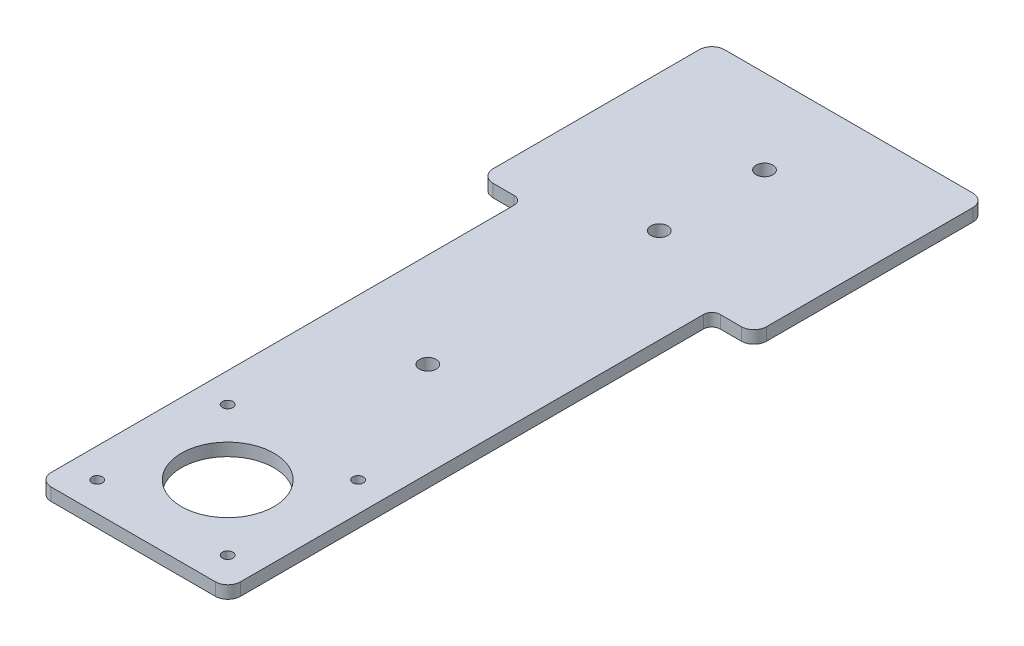
ISO-10303-21;
HEADER;
FILE_DESCRIPTION(('STEP AP214'),'2;1');
FILE_NAME('part.step','',(''),(''),'','','');
FILE_SCHEMA(('AUTOMOTIVE_DESIGN { 1 0 10303 214 1 1 1 1 }'));
ENDSEC;
DATA;
#1=APPLICATION_CONTEXT('core data for automotive mechanical design processes');
#2=APPLICATION_PROTOCOL_DEFINITION('international standard','automotive_design',2000,#1);
#3=PRODUCT_CONTEXT('',#1,'mechanical');
#4=PRODUCT('Part','Part','',(#3));
#5=PRODUCT_RELATED_PRODUCT_CATEGORY('part','',(#4));
#6=PRODUCT_DEFINITION_FORMATION('','',#4);
#7=PRODUCT_DEFINITION_CONTEXT('part definition',#1,'design');
#8=PRODUCT_DEFINITION('design','',#6,#7);
#9=PRODUCT_DEFINITION_SHAPE('','',#8);
#10=(LENGTH_UNIT() NAMED_UNIT(*) SI_UNIT(.MILLI.,.METRE.));
#11=(NAMED_UNIT(*) PLANE_ANGLE_UNIT() SI_UNIT($,.RADIAN.));
#12=(NAMED_UNIT(*) SI_UNIT($,.STERADIAN.) SOLID_ANGLE_UNIT());
#13=UNCERTAINTY_MEASURE_WITH_UNIT(LENGTH_MEASURE(1.E-05),#10,'distance_accuracy_value','');
#14=(GEOMETRIC_REPRESENTATION_CONTEXT(3) GLOBAL_UNCERTAINTY_ASSIGNED_CONTEXT((#13)) GLOBAL_UNIT_ASSIGNED_CONTEXT((#10,
#11,#12)) REPRESENTATION_CONTEXT('',''));
#15=CARTESIAN_POINT('',(0.,0.,0.));
#16=DIRECTION('',(0.,0.,1.));
#17=DIRECTION('',(1.,0.,0.));
#18=AXIS2_PLACEMENT_3D('',#15,#16,#17);
#19=CARTESIAN_POINT('',(-32.5,3.,0.));
#20=DIRECTION('',(1.,0.,0.));
#21=DIRECTION('',(0.,0.,-1.));
#22=AXIS2_PLACEMENT_3D('',#19,#20,#21);
#23=PLANE('',#22);
#24=DIRECTION('',(0.,0.,1.));
#25=VECTOR('',#24,1.);
#26=CARTESIAN_POINT('',(-32.5,0.,0.));
#27=LINE('',#26,#25);
#28=CARTESIAN_POINT('',(-32.5,0.,-108.613624170187));
#29=VERTEX_POINT('',#28);
#30=CARTESIAN_POINT('',(-32.5,0.,-59.6136241701869));
#31=VERTEX_POINT('',#30);
#32=EDGE_CURVE('E269',#29,#31,#27,.T.);
#33=ORIENTED_EDGE('',*,*,#32,.T.);
#34=DIRECTION('',(0.,-1.,0.));
#35=VECTOR('',#34,1.);
#36=CARTESIAN_POINT('',(-32.5,3.,-59.6136241701869));
#37=LINE('',#36,#35);
#38=CARTESIAN_POINT('',(-32.5,3.,-59.6136241701869));
#39=VERTEX_POINT('',#38);
#40=EDGE_CURVE('E202',#31,#39,#37,.F.);
#41=ORIENTED_EDGE('',*,*,#40,.T.);
#42=DIRECTION('',(0.,0.,1.));
#43=VECTOR('',#42,1.);
#44=CARTESIAN_POINT('',(-32.5,3.,0.));
#45=LINE('',#44,#43);
#46=CARTESIAN_POINT('',(-32.5,3.,-108.613624170187));
#47=VERTEX_POINT('',#46);
#48=EDGE_CURVE('E309',#47,#39,#45,.T.);
#49=ORIENTED_EDGE('',*,*,#48,.F.);
#50=DIRECTION('',(0.,-1.,0.));
#51=VECTOR('',#50,1.);
#52=CARTESIAN_POINT('',(-32.5,0.,-108.613624170187));
#53=LINE('',#52,#51);
#54=EDGE_CURVE('E189',#47,#29,#53,.T.);
#55=ORIENTED_EDGE('',*,*,#54,.T.);
#56=EDGE_LOOP('',(#33,#41,#49,#55));
#57=FACE_BOUND('',#56,.T.);
#58=ADVANCED_FACE('F41',(#57),#23,.F.);
#59=CARTESIAN_POINT('',(0.,3.,-56.613624170187));
#60=DIRECTION('',(0.,0.,-1.));
#61=DIRECTION('',(-1.,0.,0.));
#62=AXIS2_PLACEMENT_3D('',#59,#60,#61);
#63=PLANE('',#62);
#64=DIRECTION('',(1.,0.,0.));
#65=VECTOR('',#64,1.);
#66=CARTESIAN_POINT('',(0.,0.,-56.613624170187));
#67=LINE('',#66,#65);
#68=CARTESIAN_POINT('',(-29.5,0.,-56.6136241701869));
#69=VERTEX_POINT('',#68);
#70=CARTESIAN_POINT('',(-24.5,0.,-56.613624170187));
#71=VERTEX_POINT('',#70);
#72=EDGE_CURVE('E266',#69,#71,#67,.T.);
#73=ORIENTED_EDGE('',*,*,#72,.T.);
#74=DIRECTION('',(0.,-1.,0.));
#75=VECTOR('',#74,1.);
#76=CARTESIAN_POINT('',(-24.5,3.,-56.613624170187));
#77=LINE('',#76,#75);
#78=CARTESIAN_POINT('',(-24.5,3.,-56.613624170187));
#79=VERTEX_POINT('',#78);
#80=EDGE_CURVE('E238',#71,#79,#77,.F.);
#81=ORIENTED_EDGE('',*,*,#80,.T.);
#82=DIRECTION('',(1.,0.,0.));
#83=VECTOR('',#82,1.);
#84=CARTESIAN_POINT('',(0.,3.,-56.613624170187));
#85=LINE('',#84,#83);
#86=CARTESIAN_POINT('',(-29.5,3.,-56.6136241701869));
#87=VERTEX_POINT('',#86);
#88=EDGE_CURVE('E306',#87,#79,#85,.T.);
#89=ORIENTED_EDGE('',*,*,#88,.F.);
#90=DIRECTION('',(0.,-1.,0.));
#91=VECTOR('',#90,1.);
#92=CARTESIAN_POINT('',(-29.5,3.,-56.6136241701869));
#93=LINE('',#92,#91);
#94=EDGE_CURVE('E197',#87,#69,#93,.T.);
#95=ORIENTED_EDGE('',*,*,#94,.T.);
#96=EDGE_LOOP('',(#73,#81,#89,#95));
#97=FACE_BOUND('',#96,.T.);
#98=ADVANCED_FACE('F353',(#97),#63,.F.);
#99=CARTESIAN_POINT('',(-22.5,3.,0.));
#100=DIRECTION('',(-1.,0.,0.));
#101=DIRECTION('',(0.,0.,1.));
#102=AXIS2_PLACEMENT_3D('',#99,#100,#101);
#103=PLANE('',#102);
#104=DIRECTION('',(0.,0.,-1.));
#105=VECTOR('',#104,1.);
#106=CARTESIAN_POINT('',(-22.5,3.,0.));
#107=LINE('',#106,#105);
#108=CARTESIAN_POINT('',(-22.5,3.,55.3863758298131));
#109=VERTEX_POINT('',#108);
#110=CARTESIAN_POINT('',(-22.5,3.,-54.6136241701869));
#111=VERTEX_POINT('',#110);
#112=EDGE_CURVE('E303',#109,#111,#107,.T.);
#113=ORIENTED_EDGE('',*,*,#112,.T.);
#114=DIRECTION('',(0.,-1.,0.));
#115=VECTOR('',#114,1.);
#116=CARTESIAN_POINT('',(-22.5,3.,-54.6136241701869));
#117=LINE('',#116,#115);
#118=CARTESIAN_POINT('',(-22.5,0.,-54.6136241701869));
#119=VERTEX_POINT('',#118);
#120=EDGE_CURVE('E235',#111,#119,#117,.T.);
#121=ORIENTED_EDGE('',*,*,#120,.T.);
#122=DIRECTION('',(0.,0.,-1.));
#123=VECTOR('',#122,1.);
#124=CARTESIAN_POINT('',(-22.5,0.,0.));
#125=LINE('',#124,#123);
#126=CARTESIAN_POINT('',(-22.5,0.,55.3863758298131));
#127=VERTEX_POINT('',#126);
#128=EDGE_CURVE('E263',#127,#119,#125,.T.);
#129=ORIENTED_EDGE('',*,*,#128,.F.);
#130=DIRECTION('',(0.,-1.,0.));
#131=VECTOR('',#130,1.);
#132=CARTESIAN_POINT('',(-22.5,3.,55.3863758298131));
#133=LINE('',#132,#131);
#134=EDGE_CURVE('E231',#127,#109,#133,.F.);
#135=ORIENTED_EDGE('',*,*,#134,.T.);
#136=EDGE_LOOP('',(#113,#121,#129,#135));
#137=FACE_BOUND('',#136,.T.);
#138=ADVANCED_FACE('F359',(#137),#103,.T.);
#139=CARTESIAN_POINT('',(0.,3.,58.3863758298131));
#140=DIRECTION('',(0.,0.,1.));
#141=DIRECTION('',(1.,0.,0.));
#142=AXIS2_PLACEMENT_3D('',#139,#140,#141);
#143=PLANE('',#142);
#144=DIRECTION('',(-1.,0.,0.));
#145=VECTOR('',#144,1.);
#146=CARTESIAN_POINT('',(0.,3.,58.3863758298131));
#147=LINE('',#146,#145);
#148=CARTESIAN_POINT('',(19.5,3.,58.3863758298131));
#149=VERTEX_POINT('',#148);
#150=CARTESIAN_POINT('',(-19.5,3.,58.3863758298131));
#151=VERTEX_POINT('',#150);
#152=EDGE_CURVE('E300',#149,#151,#147,.T.);
#153=ORIENTED_EDGE('',*,*,#152,.T.);
#154=DIRECTION('',(0.,-1.,0.));
#155=VECTOR('',#154,1.);
#156=CARTESIAN_POINT('',(-19.5,3.,58.3863758298131));
#157=LINE('',#156,#155);
#158=CARTESIAN_POINT('',(-19.5,0.,58.3863758298131));
#159=VERTEX_POINT('',#158);
#160=EDGE_CURVE('E226',#151,#159,#157,.T.);
#161=ORIENTED_EDGE('',*,*,#160,.T.);
#162=DIRECTION('',(-1.,0.,0.));
#163=VECTOR('',#162,1.);
#164=CARTESIAN_POINT('',(0.,0.,58.3863758298131));
#165=LINE('',#164,#163);
#166=CARTESIAN_POINT('',(19.5,0.,58.3863758298131));
#167=VERTEX_POINT('',#166);
#168=EDGE_CURVE('E259',#167,#159,#165,.T.);
#169=ORIENTED_EDGE('',*,*,#168,.F.);
#170=DIRECTION('',(0.,-1.,0.));
#171=VECTOR('',#170,1.);
#172=CARTESIAN_POINT('',(19.5,3.,58.3863758298131));
#173=LINE('',#172,#171);
#174=EDGE_CURVE('E222',#167,#149,#173,.F.);
#175=ORIENTED_EDGE('',*,*,#174,.T.);
#176=EDGE_LOOP('',(#153,#161,#169,#175));
#177=FACE_BOUND('',#176,.T.);
#178=ADVANCED_FACE('F430',(#177),#143,.T.);
#179=CARTESIAN_POINT('',(22.5,3.,0.));
#180=DIRECTION('',(-1.,0.,0.));
#181=DIRECTION('',(0.,0.,1.));
#182=AXIS2_PLACEMENT_3D('',#179,#180,#181);
#183=PLANE('',#182);
#184=DIRECTION('',(0.,0.,-1.));
#185=VECTOR('',#184,1.);
#186=CARTESIAN_POINT('',(22.5,0.,0.));
#187=LINE('',#186,#185);
#188=CARTESIAN_POINT('',(22.5,0.,55.3863758298131));
#189=VERTEX_POINT('',#188);
#190=CARTESIAN_POINT('',(22.5,0.,-54.6136241701869));
#191=VERTEX_POINT('',#190);
#192=EDGE_CURVE('E256',#189,#191,#187,.T.);
#193=ORIENTED_EDGE('',*,*,#192,.T.);
#194=DIRECTION('',(0.,-1.,0.));
#195=VECTOR('',#194,1.);
#196=CARTESIAN_POINT('',(22.5,3.,-54.6136241701869));
#197=LINE('',#196,#195);
#198=CARTESIAN_POINT('',(22.5,3.,-54.6136241701869));
#199=VERTEX_POINT('',#198);
#200=EDGE_CURVE('E62',#191,#199,#197,.F.);
#201=ORIENTED_EDGE('',*,*,#200,.T.);
#202=DIRECTION('',(0.,0.,-1.));
#203=VECTOR('',#202,1.);
#204=CARTESIAN_POINT('',(22.5,3.,0.));
#205=LINE('',#204,#203);
#206=CARTESIAN_POINT('',(22.5,3.,55.3863758298131));
#207=VERTEX_POINT('',#206);
#208=EDGE_CURVE('E298',#207,#199,#205,.T.);
#209=ORIENTED_EDGE('',*,*,#208,.F.);
#210=DIRECTION('',(0.,-1.,0.));
#211=VECTOR('',#210,1.);
#212=CARTESIAN_POINT('',(22.5,0.,55.3863758298131));
#213=LINE('',#212,#211);
#214=EDGE_CURVE('E217',#207,#189,#213,.T.);
#215=ORIENTED_EDGE('',*,*,#214,.T.);
#216=EDGE_LOOP('',(#193,#201,#209,#215));
#217=FACE_BOUND('',#216,.T.);
#218=ADVANCED_FACE('F434',(#217),#183,.F.);
#219=CARTESIAN_POINT('',(0.,3.,-56.613624170187));
#220=DIRECTION('',(0.,0.,-1.));
#221=DIRECTION('',(-1.,0.,0.));
#222=AXIS2_PLACEMENT_3D('',#219,#220,#221);
#223=PLANE('',#222);
#224=DIRECTION('',(1.,0.,0.));
#225=VECTOR('',#224,1.);
#226=CARTESIAN_POINT('',(0.,3.,-56.613624170187));
#227=LINE('',#226,#225);
#228=CARTESIAN_POINT('',(24.5,3.,-56.613624170187));
#229=VERTEX_POINT('',#228);
#230=CARTESIAN_POINT('',(29.5,3.,-56.6136241701869));
#231=VERTEX_POINT('',#230);
#232=EDGE_CURVE('E252',#229,#231,#227,.T.);
#233=ORIENTED_EDGE('',*,*,#232,.F.);
#234=DIRECTION('',(0.,-1.,0.));
#235=VECTOR('',#234,1.);
#236=CARTESIAN_POINT('',(24.5,0.,-56.613624170187));
#237=LINE('',#236,#235);
#238=CARTESIAN_POINT('',(24.5,0.,-56.613624170187));
#239=VERTEX_POINT('',#238);
#240=EDGE_CURVE('E244',#229,#239,#237,.T.);
#241=ORIENTED_EDGE('',*,*,#240,.T.);
#242=DIRECTION('',(1.,0.,0.));
#243=VECTOR('',#242,1.);
#244=CARTESIAN_POINT('',(0.,0.,-56.613624170187));
#245=LINE('',#244,#243);
#246=CARTESIAN_POINT('',(29.5,0.,-56.6136241701869));
#247=VERTEX_POINT('',#246);
#248=EDGE_CURVE('E251',#239,#247,#245,.T.);
#249=ORIENTED_EDGE('',*,*,#248,.T.);
#250=DIRECTION('',(0.,-1.,0.));
#251=VECTOR('',#250,1.);
#252=CARTESIAN_POINT('',(29.5,3.,-56.6136241701869));
#253=LINE('',#252,#251);
#254=EDGE_CURVE('E212',#247,#231,#253,.F.);
#255=ORIENTED_EDGE('',*,*,#254,.T.);
#256=EDGE_LOOP('',(#233,#241,#249,#255));
#257=FACE_BOUND('',#256,.T.);
#258=ADVANCED_FACE('F250',(#257),#223,.F.);
#259=CARTESIAN_POINT('',(32.5,3.,0.));
#260=DIRECTION('',(1.,0.,0.));
#261=DIRECTION('',(0.,0.,-1.));
#262=AXIS2_PLACEMENT_3D('',#259,#260,#261);
#263=PLANE('',#262);
#264=DIRECTION('',(0.,0.,1.));
#265=VECTOR('',#264,1.);
#266=CARTESIAN_POINT('',(32.5,3.,0.));
#267=LINE('',#266,#265);
#268=CARTESIAN_POINT('',(32.5,3.,-108.613624170187));
#269=VERTEX_POINT('',#268);
#270=CARTESIAN_POINT('',(32.5,3.,-59.6136241701869));
#271=VERTEX_POINT('',#270);
#272=EDGE_CURVE('E294',#269,#271,#267,.T.);
#273=ORIENTED_EDGE('',*,*,#272,.T.);
#274=DIRECTION('',(0.,-1.,0.));
#275=VECTOR('',#274,1.);
#276=CARTESIAN_POINT('',(32.5,0.,-59.6136241701869));
#277=LINE('',#276,#275);
#278=CARTESIAN_POINT('',(32.5,0.,-59.6136241701869));
#279=VERTEX_POINT('',#278);
#280=EDGE_CURVE('E206',#271,#279,#277,.T.);
#281=ORIENTED_EDGE('',*,*,#280,.T.);
#282=DIRECTION('',(0.,0.,1.));
#283=VECTOR('',#282,1.);
#284=CARTESIAN_POINT('',(32.5,0.,0.));
#285=LINE('',#284,#283);
#286=CARTESIAN_POINT('',(32.5,0.,-108.613624170187));
#287=VERTEX_POINT('',#286);
#288=EDGE_CURVE('E166',#287,#279,#285,.T.);
#289=ORIENTED_EDGE('',*,*,#288,.F.);
#290=DIRECTION('',(0.,-1.,0.));
#291=VECTOR('',#290,1.);
#292=CARTESIAN_POINT('',(32.5,3.,-108.613624170187));
#293=LINE('',#292,#291);
#294=EDGE_CURVE('E174',#287,#269,#293,.F.);
#295=ORIENTED_EDGE('',*,*,#294,.T.);
#296=EDGE_LOOP('',(#273,#281,#289,#295));
#297=FACE_BOUND('',#296,.T.);
#298=ADVANCED_FACE('F446',(#297),#263,.T.);
#299=CARTESIAN_POINT('',(0.,3.,-111.613624170187));
#300=DIRECTION('',(0.,0.,-1.));
#301=DIRECTION('',(-1.,0.,0.));
#302=AXIS2_PLACEMENT_3D('',#299,#300,#301);
#303=PLANE('',#302);
#304=DIRECTION('',(1.,0.,0.));
#305=VECTOR('',#304,1.);
#306=CARTESIAN_POINT('',(0.,0.,-111.613624170187));
#307=LINE('',#306,#305);
#308=CARTESIAN_POINT('',(-29.5,0.,-111.613624170187));
#309=VERTEX_POINT('',#308);
#310=CARTESIAN_POINT('',(29.5,0.,-111.613624170187));
#311=VERTEX_POINT('',#310);
#312=EDGE_CURVE('E152',#309,#311,#307,.T.);
#313=ORIENTED_EDGE('',*,*,#312,.F.);
#314=DIRECTION('',(0.,-1.,0.));
#315=VECTOR('',#314,1.);
#316=CARTESIAN_POINT('',(-29.5,3.,-111.613624170187));
#317=LINE('',#316,#315);
#318=CARTESIAN_POINT('',(-29.5,3.,-111.613624170187));
#319=VERTEX_POINT('',#318);
#320=EDGE_CURVE('E193',#309,#319,#317,.F.);
#321=ORIENTED_EDGE('',*,*,#320,.T.);
#322=DIRECTION('',(1.,0.,0.));
#323=VECTOR('',#322,1.);
#324=CARTESIAN_POINT('',(0.,3.,-111.613624170187));
#325=LINE('',#324,#323);
#326=CARTESIAN_POINT('',(29.5,3.,-111.613624170187));
#327=VERTEX_POINT('',#326);
#328=EDGE_CURVE('E178',#319,#327,#325,.T.);
#329=ORIENTED_EDGE('',*,*,#328,.T.);
#330=DIRECTION('',(0.,-1.,0.));
#331=VECTOR('',#330,1.);
#332=CARTESIAN_POINT('',(29.5,3.,-111.613624170187));
#333=LINE('',#332,#331);
#334=EDGE_CURVE('E173',#327,#311,#333,.T.);
#335=ORIENTED_EDGE('',*,*,#334,.T.);
#336=EDGE_LOOP('',(#313,#321,#329,#335));
#337=FACE_BOUND('',#336,.T.);
#338=ADVANCED_FACE('F176',(#337),#303,.T.);
#339=CARTESIAN_POINT('',(0.,3.,-91.6136241701869));
#340=DIRECTION('',(0.,-1.,0.));
#341=DIRECTION('',(0.,0.,-1.));
#342=AXIS2_PLACEMENT_3D('',#339,#340,#341);
#343=CYLINDRICAL_SURFACE('',#342,2.);
#344=CARTESIAN_POINT('',(0.,3.,-91.6136241701869));
#345=DIRECTION('',(0.,1.,0.));
#346=DIRECTION('',(0.,0.,1.));
#347=AXIS2_PLACEMENT_3D('',#344,#345,#346);
#348=CIRCLE('',#347,2.);
#349=CARTESIAN_POINT('',(0.,3.,-89.6136241701869));
#350=VERTEX_POINT('',#349);
#351=EDGE_CURVE('E312',#350,#350,#348,.T.);
#352=ORIENTED_EDGE('',*,*,#351,.T.);
#353=EDGE_LOOP('',(#352));
#354=FACE_BOUND('',#353,.T.);
#355=CARTESIAN_POINT('',(0.,0.,-91.6136241701869));
#356=DIRECTION('',(0.,1.,0.));
#357=DIRECTION('',(0.,0.,1.));
#358=AXIS2_PLACEMENT_3D('',#355,#356,#357);
#359=CIRCLE('',#358,2.);
#360=CARTESIAN_POINT('',(0.,0.,-89.6136241701869));
#361=VERTEX_POINT('',#360);
#362=EDGE_CURVE('E272',#361,#361,#359,.T.);
#363=ORIENTED_EDGE('',*,*,#362,.F.);
#364=EDGE_LOOP('',(#363));
#365=FACE_BOUND('',#364,.T.);
#366=ADVANCED_FACE('F364',(#354,#365),#343,.F.);
#367=CARTESIAN_POINT('',(0.,3.,-66.6136241701869));
#368=DIRECTION('',(0.,-1.,0.));
#369=DIRECTION('',(0.,0.,-1.));
#370=AXIS2_PLACEMENT_3D('',#367,#368,#369);
#371=CYLINDRICAL_SURFACE('',#370,2.);
#372=CARTESIAN_POINT('',(0.,3.,-66.6136241701869));
#373=DIRECTION('',(0.,1.,0.));
#374=DIRECTION('',(0.,0.,1.));
#375=AXIS2_PLACEMENT_3D('',#372,#373,#374);
#376=CIRCLE('',#375,2.);
#377=CARTESIAN_POINT('',(0.,3.,-64.6136241701869));
#378=VERTEX_POINT('',#377);
#379=EDGE_CURVE('E315',#378,#378,#376,.T.);
#380=ORIENTED_EDGE('',*,*,#379,.T.);
#381=EDGE_LOOP('',(#380));
#382=FACE_BOUND('',#381,.T.);
#383=CARTESIAN_POINT('',(0.,0.,-66.6136241701869));
#384=DIRECTION('',(0.,1.,0.));
#385=DIRECTION('',(0.,0.,1.));
#386=AXIS2_PLACEMENT_3D('',#383,#384,#385);
#387=CIRCLE('',#386,2.);
#388=CARTESIAN_POINT('',(0.,0.,-64.6136241701869));
#389=VERTEX_POINT('',#388);
#390=EDGE_CURVE('E275',#389,#389,#387,.T.);
#391=ORIENTED_EDGE('',*,*,#390,.F.);
#392=EDGE_LOOP('',(#391));
#393=FACE_BOUND('',#392,.T.);
#394=ADVANCED_FACE('F367',(#382,#393),#371,.F.);
#395=CARTESIAN_POINT('',(-15.5,3.,20.4540396754964));
#396=DIRECTION('',(0.,-1.,0.));
#397=DIRECTION('',(0.,0.,-1.));
#398=AXIS2_PLACEMENT_3D('',#395,#396,#397);
#399=CYLINDRICAL_SURFACE('',#398,1.25);
#400=CARTESIAN_POINT('',(-15.5,3.,20.4540396754964));
#401=DIRECTION('',(0.,1.,0.));
#402=DIRECTION('',(0.,0.,1.));
#403=AXIS2_PLACEMENT_3D('',#400,#401,#402);
#404=CIRCLE('',#403,1.25);
#405=CARTESIAN_POINT('',(-15.5,3.,21.7040396754964));
#406=VERTEX_POINT('',#405);
#407=EDGE_CURVE('E318',#406,#406,#404,.T.);
#408=ORIENTED_EDGE('',*,*,#407,.T.);
#409=EDGE_LOOP('',(#408));
#410=FACE_BOUND('',#409,.T.);
#411=CARTESIAN_POINT('',(-15.5,0.,20.4540396754964));
#412=DIRECTION('',(0.,1.,0.));
#413=DIRECTION('',(0.,0.,1.));
#414=AXIS2_PLACEMENT_3D('',#411,#412,#413);
#415=CIRCLE('',#414,1.25);
#416=CARTESIAN_POINT('',(-15.5,0.,21.7040396754964));
#417=VERTEX_POINT('',#416);
#418=EDGE_CURVE('E278',#417,#417,#415,.T.);
#419=ORIENTED_EDGE('',*,*,#418,.F.);
#420=EDGE_LOOP('',(#419));
#421=FACE_BOUND('',#420,.T.);
#422=ADVANCED_FACE('F371',(#410,#421),#399,.F.);
#423=CARTESIAN_POINT('',(-15.5,3.,51.4540396754964));
#424=DIRECTION('',(0.,-1.,0.));
#425=DIRECTION('',(0.,0.,-1.));
#426=AXIS2_PLACEMENT_3D('',#423,#424,#425);
#427=CYLINDRICAL_SURFACE('',#426,1.25);
#428=CARTESIAN_POINT('',(-15.5,3.,51.4540396754964));
#429=DIRECTION('',(0.,1.,0.));
#430=DIRECTION('',(0.,0.,1.));
#431=AXIS2_PLACEMENT_3D('',#428,#429,#430);
#432=CIRCLE('',#431,1.25);
#433=CARTESIAN_POINT('',(-15.5,3.,52.7040396754964));
#434=VERTEX_POINT('',#433);
#435=EDGE_CURVE('E321',#434,#434,#432,.T.);
#436=ORIENTED_EDGE('',*,*,#435,.T.);
#437=EDGE_LOOP('',(#436));
#438=FACE_BOUND('',#437,.T.);
#439=CARTESIAN_POINT('',(-15.5,0.,51.4540396754964));
#440=DIRECTION('',(0.,1.,0.));
#441=DIRECTION('',(0.,0.,1.));
#442=AXIS2_PLACEMENT_3D('',#439,#440,#441);
#443=CIRCLE('',#442,1.25);
#444=CARTESIAN_POINT('',(-15.5,0.,52.7040396754964));
#445=VERTEX_POINT('',#444);
#446=EDGE_CURVE('E281',#445,#445,#443,.T.);
#447=ORIENTED_EDGE('',*,*,#446,.F.);
#448=EDGE_LOOP('',(#447));
#449=FACE_BOUND('',#448,.T.);
#450=ADVANCED_FACE('F375',(#438,#449),#427,.F.);
#451=CARTESIAN_POINT('',(15.5,3.,51.4540396754964));
#452=DIRECTION('',(0.,-1.,0.));
#453=DIRECTION('',(0.,0.,-1.));
#454=AXIS2_PLACEMENT_3D('',#451,#452,#453);
#455=CYLINDRICAL_SURFACE('',#454,1.25);
#456=CARTESIAN_POINT('',(15.5,3.,51.4540396754964));
#457=DIRECTION('',(0.,1.,0.));
#458=DIRECTION('',(0.,0.,1.));
#459=AXIS2_PLACEMENT_3D('',#456,#457,#458);
#460=CIRCLE('',#459,1.25);
#461=CARTESIAN_POINT('',(15.5,3.,52.7040396754964));
#462=VERTEX_POINT('',#461);
#463=EDGE_CURVE('E324',#462,#462,#460,.F.);
#464=ORIENTED_EDGE('',*,*,#463,.F.);
#465=EDGE_LOOP('',(#464));
#466=FACE_BOUND('',#465,.T.);
#467=CARTESIAN_POINT('',(15.5,0.,51.4540396754964));
#468=DIRECTION('',(0.,1.,0.));
#469=DIRECTION('',(0.,0.,1.));
#470=AXIS2_PLACEMENT_3D('',#467,#468,#469);
#471=CIRCLE('',#470,1.25);
#472=CARTESIAN_POINT('',(15.5,0.,52.7040396754964));
#473=VERTEX_POINT('',#472);
#474=EDGE_CURVE('E284',#473,#473,#471,.F.);
#475=ORIENTED_EDGE('',*,*,#474,.T.);
#476=EDGE_LOOP('',(#475));
#477=FACE_BOUND('',#476,.T.);
#478=ADVANCED_FACE('F379',(#466,#477),#455,.F.);
#479=CARTESIAN_POINT('',(0.,3.,35.9540396754964));
#480=DIRECTION('',(0.,-1.,0.));
#481=DIRECTION('',(0.,0.,-1.));
#482=AXIS2_PLACEMENT_3D('',#479,#480,#481);
#483=CYLINDRICAL_SURFACE('',#482,11.);
#484=CARTESIAN_POINT('',(0.,3.,35.9540396754964));
#485=DIRECTION('',(0.,1.,0.));
#486=DIRECTION('',(0.,0.,1.));
#487=AXIS2_PLACEMENT_3D('',#484,#485,#486);
#488=CIRCLE('',#487,11.);
#489=CARTESIAN_POINT('',(0.,3.,46.9540396754964));
#490=VERTEX_POINT('',#489);
#491=EDGE_CURVE('E327',#490,#490,#488,.T.);
#492=ORIENTED_EDGE('',*,*,#491,.T.);
#493=EDGE_LOOP('',(#492));
#494=FACE_BOUND('',#493,.T.);
#495=CARTESIAN_POINT('',(0.,0.,35.9540396754964));
#496=DIRECTION('',(0.,1.,0.));
#497=DIRECTION('',(0.,0.,1.));
#498=AXIS2_PLACEMENT_3D('',#495,#496,#497);
#499=CIRCLE('',#498,11.);
#500=CARTESIAN_POINT('',(0.,0.,46.9540396754964));
#501=VERTEX_POINT('',#500);
#502=EDGE_CURVE('E287',#501,#501,#499,.T.);
#503=ORIENTED_EDGE('',*,*,#502,.F.);
#504=EDGE_LOOP('',(#503));
#505=FACE_BOUND('',#504,.T.);
#506=ADVANCED_FACE('F383',(#494,#505),#483,.F.);
#507=CARTESIAN_POINT('',(0.,3.,-11.6136241701869));
#508=DIRECTION('',(0.,-1.,0.));
#509=DIRECTION('',(0.,0.,-1.));
#510=AXIS2_PLACEMENT_3D('',#507,#508,#509);
#511=CYLINDRICAL_SURFACE('',#510,2.);
#512=CARTESIAN_POINT('',(0.,3.,-11.6136241701869));
#513=DIRECTION('',(0.,1.,0.));
#514=DIRECTION('',(0.,0.,1.));
#515=AXIS2_PLACEMENT_3D('',#512,#513,#514);
#516=CIRCLE('',#515,2.);
#517=CARTESIAN_POINT('',(0.,3.,-9.61362417018694));
#518=VERTEX_POINT('',#517);
#519=EDGE_CURVE('E330',#518,#518,#516,.T.);
#520=ORIENTED_EDGE('',*,*,#519,.T.);
#521=EDGE_LOOP('',(#520));
#522=FACE_BOUND('',#521,.T.);
#523=CARTESIAN_POINT('',(0.,0.,-11.6136241701869));
#524=DIRECTION('',(0.,1.,0.));
#525=DIRECTION('',(0.,0.,1.));
#526=AXIS2_PLACEMENT_3D('',#523,#524,#525);
#527=CIRCLE('',#526,2.);
#528=CARTESIAN_POINT('',(0.,0.,-9.61362417018694));
#529=VERTEX_POINT('',#528);
#530=EDGE_CURVE('E290',#529,#529,#527,.T.);
#531=ORIENTED_EDGE('',*,*,#530,.F.);
#532=EDGE_LOOP('',(#531));
#533=FACE_BOUND('',#532,.T.);
#534=ADVANCED_FACE('F387',(#522,#533),#511,.F.);
#535=CARTESIAN_POINT('',(15.5,3.,20.4540396754964));
#536=DIRECTION('',(0.,-1.,0.));
#537=DIRECTION('',(0.,0.,-1.));
#538=AXIS2_PLACEMENT_3D('',#535,#536,#537);
#539=CYLINDRICAL_SURFACE('',#538,1.25);
#540=CARTESIAN_POINT('',(15.5,3.,20.4540396754964));
#541=DIRECTION('',(0.,1.,0.));
#542=DIRECTION('',(0.,0.,1.));
#543=AXIS2_PLACEMENT_3D('',#540,#541,#542);
#544=CIRCLE('',#543,1.25);
#545=CARTESIAN_POINT('',(15.5,3.,21.7040396754964));
#546=VERTEX_POINT('',#545);
#547=EDGE_CURVE('E180',#546,#546,#544,.F.);
#548=ORIENTED_EDGE('',*,*,#547,.F.);
#549=EDGE_LOOP('',(#548));
#550=FACE_BOUND('',#549,.T.);
#551=CARTESIAN_POINT('',(15.5,0.,20.4540396754964));
#552=DIRECTION('',(0.,1.,0.));
#553=DIRECTION('',(0.,0.,1.));
#554=AXIS2_PLACEMENT_3D('',#551,#552,#553);
#555=CIRCLE('',#554,1.25);
#556=CARTESIAN_POINT('',(15.5,0.,21.7040396754964));
#557=VERTEX_POINT('',#556);
#558=EDGE_CURVE('E165',#557,#557,#555,.F.);
#559=ORIENTED_EDGE('',*,*,#558,.T.);
#560=EDGE_LOOP('',(#559));
#561=FACE_BOUND('',#560,.T.);
#562=ADVANCED_FACE('F337',(#550,#561),#539,.F.);
#563=CARTESIAN_POINT('',(0.,3.,0.));
#564=DIRECTION('',(0.,1.,0.));
#565=DIRECTION('',(0.,0.,1.));
#566=AXIS2_PLACEMENT_3D('',#563,#564,#565);
#567=PLANE('',#566);
#568=ORIENTED_EDGE('',*,*,#519,.F.);
#569=EDGE_LOOP('',(#568));
#570=FACE_BOUND('',#569,.T.);
#571=ORIENTED_EDGE('',*,*,#491,.F.);
#572=EDGE_LOOP('',(#571));
#573=FACE_BOUND('',#572,.T.);
#574=ORIENTED_EDGE('',*,*,#463,.T.);
#575=EDGE_LOOP('',(#574));
#576=FACE_BOUND('',#575,.T.);
#577=ORIENTED_EDGE('',*,*,#435,.F.);
#578=EDGE_LOOP('',(#577));
#579=FACE_BOUND('',#578,.T.);
#580=ORIENTED_EDGE('',*,*,#407,.F.);
#581=EDGE_LOOP('',(#580));
#582=FACE_BOUND('',#581,.T.);
#583=ORIENTED_EDGE('',*,*,#379,.F.);
#584=EDGE_LOOP('',(#583));
#585=FACE_BOUND('',#584,.T.);
#586=ORIENTED_EDGE('',*,*,#351,.F.);
#587=EDGE_LOOP('',(#586));
#588=FACE_BOUND('',#587,.T.);
#589=ORIENTED_EDGE('',*,*,#112,.F.);
#590=CARTESIAN_POINT('',(-19.5,3.,55.3863758298131));
#591=DIRECTION('',(0.,1.,0.));
#592=DIRECTION('',(0.,0.,1.));
#593=AXIS2_PLACEMENT_3D('',#590,#591,#592);
#594=CIRCLE('',#593,3.);
#595=EDGE_CURVE('E233',#109,#151,#594,.T.);
#596=ORIENTED_EDGE('',*,*,#595,.T.);
#597=ORIENTED_EDGE('',*,*,#152,.F.);
#598=CARTESIAN_POINT('',(19.5,3.,55.3863758298131));
#599=DIRECTION('',(0.,1.,0.));
#600=DIRECTION('',(0.,0.,1.));
#601=AXIS2_PLACEMENT_3D('',#598,#599,#600);
#602=CIRCLE('',#601,3.);
#603=EDGE_CURVE('E224',#149,#207,#602,.T.);
#604=ORIENTED_EDGE('',*,*,#603,.T.);
#605=ORIENTED_EDGE('',*,*,#208,.T.);
#606=CARTESIAN_POINT('',(24.5,3.,-54.6136241701869));
#607=DIRECTION('',(0.,1.,0.));
#608=DIRECTION('',(0.,0.,1.));
#609=AXIS2_PLACEMENT_3D('',#606,#607,#608);
#610=CIRCLE('',#609,2.);
#611=EDGE_CURVE('E11',#199,#229,#610,.F.);
#612=ORIENTED_EDGE('',*,*,#611,.T.);
#613=ORIENTED_EDGE('',*,*,#232,.T.);
#614=CARTESIAN_POINT('',(29.5,3.,-59.6136241701869));
#615=DIRECTION('',(0.,1.,0.));
#616=DIRECTION('',(0.,0.,1.));
#617=AXIS2_PLACEMENT_3D('',#614,#615,#616);
#618=CIRCLE('',#617,3.);
#619=EDGE_CURVE('E215',#231,#271,#618,.T.);
#620=ORIENTED_EDGE('',*,*,#619,.T.);
#621=ORIENTED_EDGE('',*,*,#272,.F.);
#622=CARTESIAN_POINT('',(29.5,3.,-108.613624170187));
#623=DIRECTION('',(0.,1.,0.));
#624=DIRECTION('',(0.,0.,1.));
#625=AXIS2_PLACEMENT_3D('',#622,#623,#624);
#626=CIRCLE('',#625,3.);
#627=EDGE_CURVE('E187',#269,#327,#626,.T.);
#628=ORIENTED_EDGE('',*,*,#627,.T.);
#629=ORIENTED_EDGE('',*,*,#328,.F.);
#630=CARTESIAN_POINT('',(-29.5,3.,-108.613624170187));
#631=DIRECTION('',(0.,1.,0.));
#632=DIRECTION('',(0.,0.,1.));
#633=AXIS2_PLACEMENT_3D('',#630,#631,#632);
#634=CIRCLE('',#633,3.);
#635=EDGE_CURVE('E195',#319,#47,#634,.T.);
#636=ORIENTED_EDGE('',*,*,#635,.T.);
#637=ORIENTED_EDGE('',*,*,#48,.T.);
#638=CARTESIAN_POINT('',(-29.5,3.,-59.6136241701869));
#639=DIRECTION('',(0.,1.,0.));
#640=DIRECTION('',(0.,0.,1.));
#641=AXIS2_PLACEMENT_3D('',#638,#639,#640);
#642=CIRCLE('',#641,3.);
#643=EDGE_CURVE('E204',#39,#87,#642,.T.);
#644=ORIENTED_EDGE('',*,*,#643,.T.);
#645=ORIENTED_EDGE('',*,*,#88,.T.);
#646=CARTESIAN_POINT('',(-24.5,3.,-54.6136241701869));
#647=DIRECTION('',(0.,1.,0.));
#648=DIRECTION('',(0.,0.,1.));
#649=AXIS2_PLACEMENT_3D('',#646,#647,#648);
#650=CIRCLE('',#649,2.);
#651=EDGE_CURVE('E242',#79,#111,#650,.F.);
#652=ORIENTED_EDGE('',*,*,#651,.T.);
#653=EDGE_LOOP('',(#589,#596,#597,#604,#605,#612,#613,#620,#621,#628,#629,#636,#637,#644,#645,#652));
#654=FACE_BOUND('',#653,.T.);
#655=ORIENTED_EDGE('',*,*,#547,.T.);
#656=EDGE_LOOP('',(#655));
#657=FACE_BOUND('',#656,.T.);
#658=ADVANCED_FACE('F339',(#570,#573,#576,#579,#582,#585,#588,#654,#657),#567,.T.);
#659=CARTESIAN_POINT('',(0.,0.,0.));
#660=DIRECTION('',(0.,1.,0.));
#661=DIRECTION('',(0.,0.,1.));
#662=AXIS2_PLACEMENT_3D('',#659,#660,#661);
#663=PLANE('',#662);
#664=ORIENTED_EDGE('',*,*,#530,.T.);
#665=EDGE_LOOP('',(#664));
#666=FACE_BOUND('',#665,.T.);
#667=ORIENTED_EDGE('',*,*,#502,.T.);
#668=EDGE_LOOP('',(#667));
#669=FACE_BOUND('',#668,.T.);
#670=ORIENTED_EDGE('',*,*,#474,.F.);
#671=EDGE_LOOP('',(#670));
#672=FACE_BOUND('',#671,.T.);
#673=ORIENTED_EDGE('',*,*,#446,.T.);
#674=EDGE_LOOP('',(#673));
#675=FACE_BOUND('',#674,.T.);
#676=ORIENTED_EDGE('',*,*,#418,.T.);
#677=EDGE_LOOP('',(#676));
#678=FACE_BOUND('',#677,.T.);
#679=ORIENTED_EDGE('',*,*,#390,.T.);
#680=EDGE_LOOP('',(#679));
#681=FACE_BOUND('',#680,.T.);
#682=ORIENTED_EDGE('',*,*,#362,.T.);
#683=EDGE_LOOP('',(#682));
#684=FACE_BOUND('',#683,.T.);
#685=ORIENTED_EDGE('',*,*,#168,.T.);
#686=CARTESIAN_POINT('',(-19.5,0.,55.3863758298131));
#687=DIRECTION('',(0.,1.,0.));
#688=DIRECTION('',(0.,0.,1.));
#689=AXIS2_PLACEMENT_3D('',#686,#687,#688);
#690=CIRCLE('',#689,3.);
#691=EDGE_CURVE('E229',#159,#127,#690,.F.);
#692=ORIENTED_EDGE('',*,*,#691,.T.);
#693=ORIENTED_EDGE('',*,*,#128,.T.);
#694=CARTESIAN_POINT('',(-24.5,0.,-54.6136241701869));
#695=DIRECTION('',(0.,1.,0.));
#696=DIRECTION('',(0.,0.,1.));
#697=AXIS2_PLACEMENT_3D('',#694,#695,#696);
#698=CIRCLE('',#697,2.);
#699=EDGE_CURVE('E240',#119,#71,#698,.T.);
#700=ORIENTED_EDGE('',*,*,#699,.T.);
#701=ORIENTED_EDGE('',*,*,#72,.F.);
#702=CARTESIAN_POINT('',(-29.5,0.,-59.6136241701869));
#703=DIRECTION('',(0.,1.,0.));
#704=DIRECTION('',(0.,0.,1.));
#705=AXIS2_PLACEMENT_3D('',#702,#703,#704);
#706=CIRCLE('',#705,3.);
#707=EDGE_CURVE('E200',#69,#31,#706,.F.);
#708=ORIENTED_EDGE('',*,*,#707,.T.);
#709=ORIENTED_EDGE('',*,*,#32,.F.);
#710=CARTESIAN_POINT('',(-29.5,0.,-108.613624170187));
#711=DIRECTION('',(0.,1.,0.));
#712=DIRECTION('',(0.,0.,1.));
#713=AXIS2_PLACEMENT_3D('',#710,#711,#712);
#714=CIRCLE('',#713,3.);
#715=EDGE_CURVE('E161',#29,#309,#714,.F.);
#716=ORIENTED_EDGE('',*,*,#715,.T.);
#717=ORIENTED_EDGE('',*,*,#312,.T.);
#718=CARTESIAN_POINT('',(29.5,0.,-108.613624170187));
#719=DIRECTION('',(0.,1.,0.));
#720=DIRECTION('',(0.,0.,1.));
#721=AXIS2_PLACEMENT_3D('',#718,#719,#720);
#722=CIRCLE('',#721,3.);
#723=EDGE_CURVE('E158',#311,#287,#722,.F.);
#724=ORIENTED_EDGE('',*,*,#723,.T.);
#725=ORIENTED_EDGE('',*,*,#288,.T.);
#726=CARTESIAN_POINT('',(29.5,0.,-59.6136241701869));
#727=DIRECTION('',(0.,1.,0.));
#728=DIRECTION('',(0.,0.,1.));
#729=AXIS2_PLACEMENT_3D('',#726,#727,#728);
#730=CIRCLE('',#729,3.);
#731=EDGE_CURVE('E209',#279,#247,#730,.F.);
#732=ORIENTED_EDGE('',*,*,#731,.T.);
#733=ORIENTED_EDGE('',*,*,#248,.F.);
#734=CARTESIAN_POINT('',(24.5,0.,-54.6136241701869));
#735=DIRECTION('',(0.,1.,0.));
#736=DIRECTION('',(0.,0.,1.));
#737=AXIS2_PLACEMENT_3D('',#734,#735,#736);
#738=CIRCLE('',#737,2.);
#739=EDGE_CURVE('E49',#239,#191,#738,.T.);
#740=ORIENTED_EDGE('',*,*,#739,.T.);
#741=ORIENTED_EDGE('',*,*,#192,.F.);
#742=CARTESIAN_POINT('',(19.5,0.,55.3863758298131));
#743=DIRECTION('',(0.,1.,0.));
#744=DIRECTION('',(0.,0.,1.));
#745=AXIS2_PLACEMENT_3D('',#742,#743,#744);
#746=CIRCLE('',#745,3.);
#747=EDGE_CURVE('E220',#189,#167,#746,.F.);
#748=ORIENTED_EDGE('',*,*,#747,.T.);
#749=EDGE_LOOP('',(#685,#692,#693,#700,#701,#708,#709,#716,#717,#724,#725,#732,#733,#740,#741,#748));
#750=FACE_BOUND('',#749,.T.);
#751=ORIENTED_EDGE('',*,*,#558,.F.);
#752=EDGE_LOOP('',(#751));
#753=FACE_BOUND('',#752,.T.);
#754=ADVANCED_FACE('F155',(#666,#669,#672,#675,#678,#681,#684,#750,#753),#663,.F.);
#755=CARTESIAN_POINT('',(29.5,3.,-108.613624170187));
#756=DIRECTION('',(0.,-1.,0.));
#757=DIRECTION('',(0.,0.,-1.));
#758=AXIS2_PLACEMENT_3D('',#755,#756,#757);
#759=CYLINDRICAL_SURFACE('',#758,3.);
#760=ORIENTED_EDGE('',*,*,#627,.F.);
#761=ORIENTED_EDGE('',*,*,#294,.F.);
#762=ORIENTED_EDGE('',*,*,#723,.F.);
#763=ORIENTED_EDGE('',*,*,#334,.F.);
#764=EDGE_LOOP('',(#760,#761,#762,#763));
#765=FACE_BOUND('',#764,.T.);
#766=ADVANCED_FACE('F172',(#765),#759,.T.);
#767=CARTESIAN_POINT('',(-29.5,3.,-108.613624170187));
#768=DIRECTION('',(0.,1.,0.));
#769=DIRECTION('',(0.,0.,1.));
#770=AXIS2_PLACEMENT_3D('',#767,#768,#769);
#771=CYLINDRICAL_SURFACE('',#770,3.);
#772=ORIENTED_EDGE('',*,*,#635,.F.);
#773=ORIENTED_EDGE('',*,*,#320,.F.);
#774=ORIENTED_EDGE('',*,*,#715,.F.);
#775=ORIENTED_EDGE('',*,*,#54,.F.);
#776=EDGE_LOOP('',(#772,#773,#774,#775));
#777=FACE_BOUND('',#776,.T.);
#778=ADVANCED_FACE('F346',(#777),#771,.T.);
#779=CARTESIAN_POINT('',(-29.5,3.,-59.6136241701869));
#780=DIRECTION('',(0.,-1.,0.));
#781=DIRECTION('',(0.,0.,-1.));
#782=AXIS2_PLACEMENT_3D('',#779,#780,#781);
#783=CYLINDRICAL_SURFACE('',#782,3.);
#784=ORIENTED_EDGE('',*,*,#643,.F.);
#785=ORIENTED_EDGE('',*,*,#40,.F.);
#786=ORIENTED_EDGE('',*,*,#707,.F.);
#787=ORIENTED_EDGE('',*,*,#94,.F.);
#788=EDGE_LOOP('',(#784,#785,#786,#787));
#789=FACE_BOUND('',#788,.T.);
#790=ADVANCED_FACE('F393',(#789),#783,.T.);
#791=CARTESIAN_POINT('',(29.5,3.,-59.6136241701869));
#792=DIRECTION('',(0.,1.,0.));
#793=DIRECTION('',(0.,0.,1.));
#794=AXIS2_PLACEMENT_3D('',#791,#792,#793);
#795=CYLINDRICAL_SURFACE('',#794,3.);
#796=ORIENTED_EDGE('',*,*,#619,.F.);
#797=ORIENTED_EDGE('',*,*,#254,.F.);
#798=ORIENTED_EDGE('',*,*,#731,.F.);
#799=ORIENTED_EDGE('',*,*,#280,.F.);
#800=EDGE_LOOP('',(#796,#797,#798,#799));
#801=FACE_BOUND('',#800,.T.);
#802=ADVANCED_FACE('F397',(#801),#795,.T.);
#803=CARTESIAN_POINT('',(19.5,3.,55.3863758298131));
#804=DIRECTION('',(0.,1.,0.));
#805=DIRECTION('',(0.,0.,1.));
#806=AXIS2_PLACEMENT_3D('',#803,#804,#805);
#807=CYLINDRICAL_SURFACE('',#806,3.);
#808=ORIENTED_EDGE('',*,*,#603,.F.);
#809=ORIENTED_EDGE('',*,*,#174,.F.);
#810=ORIENTED_EDGE('',*,*,#747,.F.);
#811=ORIENTED_EDGE('',*,*,#214,.F.);
#812=EDGE_LOOP('',(#808,#809,#810,#811));
#813=FACE_BOUND('',#812,.T.);
#814=ADVANCED_FACE('F401',(#813),#807,.T.);
#815=CARTESIAN_POINT('',(-19.5,3.,55.3863758298131));
#816=DIRECTION('',(0.,-1.,0.));
#817=DIRECTION('',(0.,0.,-1.));
#818=AXIS2_PLACEMENT_3D('',#815,#816,#817);
#819=CYLINDRICAL_SURFACE('',#818,3.);
#820=ORIENTED_EDGE('',*,*,#595,.F.);
#821=ORIENTED_EDGE('',*,*,#134,.F.);
#822=ORIENTED_EDGE('',*,*,#691,.F.);
#823=ORIENTED_EDGE('',*,*,#160,.F.);
#824=EDGE_LOOP('',(#820,#821,#822,#823));
#825=FACE_BOUND('',#824,.T.);
#826=ADVANCED_FACE('F405',(#825),#819,.T.);
#827=CARTESIAN_POINT('',(-24.5,3.,-54.6136241701869));
#828=DIRECTION('',(0.,-1.,0.));
#829=DIRECTION('',(0.,0.,-1.));
#830=AXIS2_PLACEMENT_3D('',#827,#828,#829);
#831=CYLINDRICAL_SURFACE('',#830,2.);
#832=ORIENTED_EDGE('',*,*,#651,.F.);
#833=ORIENTED_EDGE('',*,*,#80,.F.);
#834=ORIENTED_EDGE('',*,*,#699,.F.);
#835=ORIENTED_EDGE('',*,*,#120,.F.);
#836=EDGE_LOOP('',(#832,#833,#834,#835));
#837=FACE_BOUND('',#836,.T.);
#838=ADVANCED_FACE('F408',(#837),#831,.F.);
#839=CARTESIAN_POINT('',(24.5,3.,-54.6136241701869));
#840=DIRECTION('',(0.,1.,0.));
#841=DIRECTION('',(0.,0.,1.));
#842=AXIS2_PLACEMENT_3D('',#839,#840,#841);
#843=CYLINDRICAL_SURFACE('',#842,2.);
#844=ORIENTED_EDGE('',*,*,#611,.F.);
#845=ORIENTED_EDGE('',*,*,#200,.F.);
#846=ORIENTED_EDGE('',*,*,#739,.F.);
#847=ORIENTED_EDGE('',*,*,#240,.F.);
#848=EDGE_LOOP('',(#844,#845,#846,#847));
#849=FACE_BOUND('',#848,.T.);
#850=ADVANCED_FACE('F43',(#849),#843,.F.);
#851=CLOSED_SHELL('',(#58,#98,#138,#178,#218,#258,#298,#338,#366,#394,#422,#450,#478,#506,#534,
#562,#658,#754,#766,#778,#790,#802,#814,#826,#838,#850));
#852=MANIFOLD_SOLID_BREP('B2',#851);
#853=ADVANCED_BREP_SHAPE_REPRESENTATION('',(#18,#852),#14);
#854=SHAPE_DEFINITION_REPRESENTATION(#9,#853);
ENDSEC;
END-ISO-10303-21;
